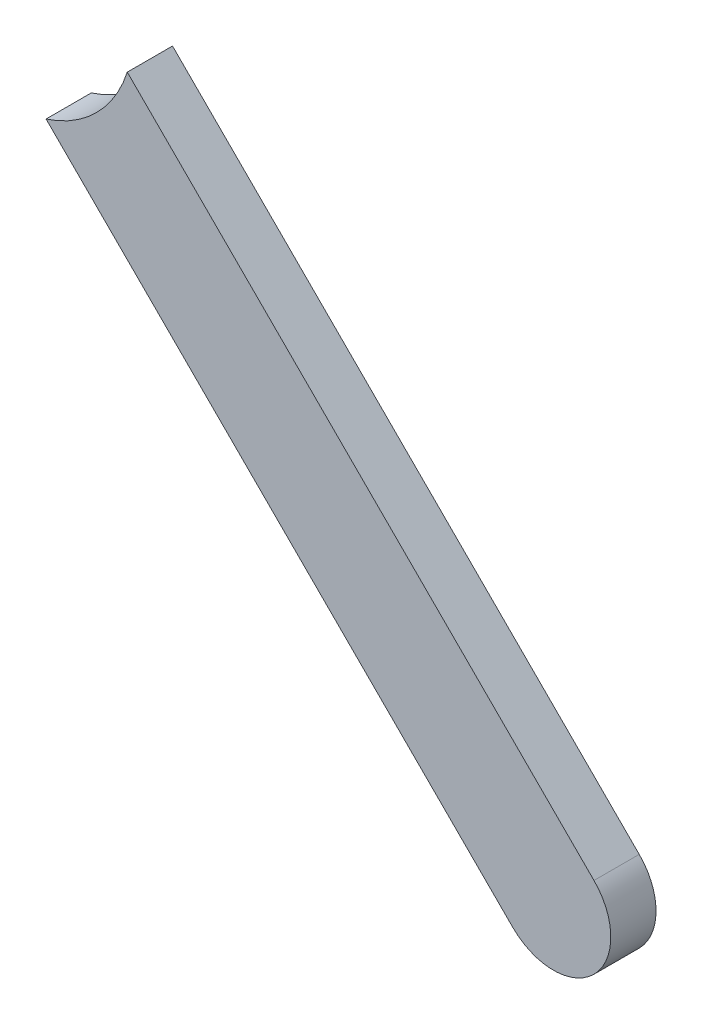
ISO-10303-21;
HEADER;
FILE_DESCRIPTION(('STEP AP214'),'2;1');
FILE_NAME('part.step','',(''),(''),'','','');
FILE_SCHEMA(('AUTOMOTIVE_DESIGN { 1 0 10303 214 1 1 1 1 }'));
ENDSEC;
DATA;
#1=APPLICATION_CONTEXT('core data for automotive mechanical design processes');
#2=APPLICATION_PROTOCOL_DEFINITION('international standard','automotive_design',2000,#1);
#3=PRODUCT_CONTEXT('',#1,'mechanical');
#4=PRODUCT('Part','Part','',(#3));
#5=PRODUCT_RELATED_PRODUCT_CATEGORY('part','',(#4));
#6=PRODUCT_DEFINITION_FORMATION('','',#4);
#7=PRODUCT_DEFINITION_CONTEXT('part definition',#1,'design');
#8=PRODUCT_DEFINITION('design','',#6,#7);
#9=PRODUCT_DEFINITION_SHAPE('','',#8);
#10=(LENGTH_UNIT() NAMED_UNIT(*) SI_UNIT(.MILLI.,.METRE.));
#11=(NAMED_UNIT(*) PLANE_ANGLE_UNIT() SI_UNIT($,.RADIAN.));
#12=(NAMED_UNIT(*) SI_UNIT($,.STERADIAN.) SOLID_ANGLE_UNIT());
#13=UNCERTAINTY_MEASURE_WITH_UNIT(LENGTH_MEASURE(1.E-05),#10,'distance_accuracy_value','');
#14=(GEOMETRIC_REPRESENTATION_CONTEXT(3) GLOBAL_UNCERTAINTY_ASSIGNED_CONTEXT((#13)) GLOBAL_UNIT_ASSIGNED_CONTEXT((#10,
#11,#12)) REPRESENTATION_CONTEXT('',''));
#15=CARTESIAN_POINT('',(0.,0.,0.));
#16=DIRECTION('',(0.,0.,1.));
#17=DIRECTION('',(1.,0.,0.));
#18=AXIS2_PLACEMENT_3D('',#15,#16,#17);
#19=CARTESIAN_POINT('',(149.140329064847,92.9404643951531,0.));
#20=DIRECTION('',(0.70710678118655,0.707106781186545,0.));
#21=DIRECTION('',(0.707106781186545,-0.70710678118655,0.));
#22=AXIS2_PLACEMENT_3D('',#19,#20,#21);
#23=PLANE('',#22);
#24=DIRECTION('',(0.707106781186545,-0.70710678118655,0.));
#25=VECTOR('',#24,1.);
#26=CARTESIAN_POINT('',(148.7913966,93.28939686,0.1999996));
#27=LINE('',#26,#25);
#28=CARTESIAN_POINT('',(149.140329064847,92.9404643951531,0.1999996));
#29=VERTEX_POINT('',#28);
#30=CARTESIAN_POINT('',(151.20439406,90.8763994,0.1999996));
#31=VERTEX_POINT('',#30);
#32=EDGE_CURVE('E11',#29,#31,#27,.T.);
#33=ORIENTED_EDGE('',*,*,#32,.F.);
#34=DIRECTION('',(0.,0.,1.));
#35=VECTOR('',#34,1.);
#36=CARTESIAN_POINT('',(149.140329064847,92.9404643951531,0.));
#37=LINE('',#36,#35);
#38=CARTESIAN_POINT('',(149.140329064847,92.9404643951531,0.));
#39=VERTEX_POINT('',#38);
#40=EDGE_CURVE('E24',#39,#29,#37,.T.);
#41=ORIENTED_EDGE('',*,*,#40,.F.);
#42=DIRECTION('',(0.707106781186545,-0.70710678118655,0.));
#43=VECTOR('',#42,1.);
#44=CARTESIAN_POINT('',(148.7913966,93.28939686,0.));
#45=LINE('',#44,#43);
#46=CARTESIAN_POINT('',(151.20439406,90.8763994,0.));
#47=VERTEX_POINT('',#46);
#48=EDGE_CURVE('E75',#39,#47,#45,.T.);
#49=ORIENTED_EDGE('',*,*,#48,.T.);
#50=DIRECTION('',(0.,0.,1.));
#51=VECTOR('',#50,1.);
#52=CARTESIAN_POINT('',(151.20439406,90.8763994,0.));
#53=LINE('',#52,#51);
#54=EDGE_CURVE('E37',#47,#31,#53,.T.);
#55=ORIENTED_EDGE('',*,*,#54,.T.);
#56=EDGE_LOOP('',(#33,#41,#49,#55));
#57=FACE_BOUND('',#56,.T.);
#58=ADVANCED_FACE('F17',(#57),#23,.F.);
#59=CARTESIAN_POINT('',(151.38399873,91.05600407,0.));
#60=DIRECTION('',(0.,0.,-1.));
#61=DIRECTION('',(-0.707106781186548,-0.707106781186548,0.));
#62=AXIS2_PLACEMENT_3D('',#59,#60,#61);
#63=CYLINDRICAL_SURFACE('',#62,0.253999360179546);
#64=CARTESIAN_POINT('',(151.38399873,91.05600407,0.1999996));
#65=DIRECTION('',(0.,0.,1.));
#66=DIRECTION('',(-0.707106781186548,-0.707106781186548,0.));
#67=AXIS2_PLACEMENT_3D('',#64,#65,#66);
#68=CIRCLE('',#67,0.253999360179546);
#69=CARTESIAN_POINT('',(151.5636034,91.23560874,0.1999996));
#70=VERTEX_POINT('',#69);
#71=EDGE_CURVE('E83',#31,#70,#68,.T.);
#72=ORIENTED_EDGE('',*,*,#71,.F.);
#73=ORIENTED_EDGE('',*,*,#54,.F.);
#74=CARTESIAN_POINT('',(151.38399873,91.05600407,0.));
#75=DIRECTION('',(0.,0.,1.));
#76=DIRECTION('',(-0.707106781186548,-0.707106781186548,0.));
#77=AXIS2_PLACEMENT_3D('',#74,#75,#76);
#78=CIRCLE('',#77,0.253999360179546);
#79=CARTESIAN_POINT('',(151.5636034,91.23560874,0.));
#80=VERTEX_POINT('',#79);
#81=EDGE_CURVE('E81',#47,#80,#78,.T.);
#82=ORIENTED_EDGE('',*,*,#81,.T.);
#83=DIRECTION('',(0.,0.,1.));
#84=VECTOR('',#83,1.);
#85=CARTESIAN_POINT('',(151.5636034,91.23560874,0.));
#86=LINE('',#85,#84);
#87=EDGE_CURVE('E67',#80,#70,#86,.T.);
#88=ORIENTED_EDGE('',*,*,#87,.T.);
#89=EDGE_LOOP('',(#72,#73,#82,#88));
#90=FACE_BOUND('',#89,.T.);
#91=ADVANCED_FACE('F89',(#90),#63,.T.);
#92=CARTESIAN_POINT('',(151.5636034,91.23560874,0.));
#93=DIRECTION('',(-0.707106781186545,-0.70710678118655,0.));
#94=DIRECTION('',(-0.70710678118655,0.707106781186545,0.));
#95=AXIS2_PLACEMENT_3D('',#92,#93,#94);
#96=PLANE('',#95);
#97=DIRECTION('',(-0.70710678118655,0.707106781186545,0.));
#98=VECTOR('',#97,1.);
#99=CARTESIAN_POINT('',(151.5636034,91.23560874,0.1999996));
#100=LINE('',#99,#98);
#101=CARTESIAN_POINT('',(149.499538404847,93.2996737351531,0.1999996));
#102=VERTEX_POINT('',#101);
#103=EDGE_CURVE('E71',#70,#102,#100,.T.);
#104=ORIENTED_EDGE('',*,*,#103,.F.);
#105=ORIENTED_EDGE('',*,*,#87,.F.);
#106=DIRECTION('',(-0.70710678118655,0.707106781186545,0.));
#107=VECTOR('',#106,1.);
#108=CARTESIAN_POINT('',(151.5636034,91.23560874,0.));
#109=LINE('',#108,#107);
#110=CARTESIAN_POINT('',(149.499538404847,93.2996737351531,0.));
#111=VERTEX_POINT('',#110);
#112=EDGE_CURVE('E63',#80,#111,#109,.T.);
#113=ORIENTED_EDGE('',*,*,#112,.T.);
#114=DIRECTION('',(0.,0.,1.));
#115=VECTOR('',#114,1.);
#116=CARTESIAN_POINT('',(149.499538404847,93.2996737351531,0.));
#117=LINE('',#116,#115);
#118=EDGE_CURVE('E53',#111,#102,#117,.T.);
#119=ORIENTED_EDGE('',*,*,#118,.T.);
#120=EDGE_LOOP('',(#104,#105,#113,#119));
#121=FACE_BOUND('',#120,.T.);
#122=ADVANCED_FACE('F66',(#121),#96,.F.);
#123=CARTESIAN_POINT('',(148.971,93.4690028,0.));
#124=DIRECTION('',(0.,0.,-1.));
#125=DIRECTION('',(1.,0.,0.));
#126=AXIS2_PLACEMENT_3D('',#123,#124,#125);
#127=CYLINDRICAL_SURFACE('',#126,0.55500016);
#128=ORIENTED_EDGE('',*,*,#40,.T.);
#129=CARTESIAN_POINT('',(148.971,93.4690028,0.1999996));
#130=DIRECTION('',(0.,0.,1.));
#131=DIRECTION('',(1.,0.,0.));
#132=AXIS2_PLACEMENT_3D('',#129,#130,#131);
#133=CIRCLE('',#132,0.55500016);
#134=EDGE_CURVE('E59',#29,#102,#133,.T.);
#135=ORIENTED_EDGE('',*,*,#134,.T.);
#136=ORIENTED_EDGE('',*,*,#118,.F.);
#137=CARTESIAN_POINT('',(148.971,93.4690028,0.));
#138=DIRECTION('',(0.,0.,1.));
#139=DIRECTION('',(1.,0.,0.));
#140=AXIS2_PLACEMENT_3D('',#137,#138,#139);
#141=CIRCLE('',#140,0.55500016);
#142=EDGE_CURVE('E57',#39,#111,#141,.T.);
#143=ORIENTED_EDGE('',*,*,#142,.F.);
#144=EDGE_LOOP('',(#128,#135,#136,#143));
#145=FACE_BOUND('',#144,.T.);
#146=ADVANCED_FACE('F55',(#145),#127,.F.);
#147=CARTESIAN_POINT('',(148.7913966,93.28939686,0.));
#148=DIRECTION('',(0.,0.,-1.));
#149=DIRECTION('',(-1.,0.,0.));
#150=AXIS2_PLACEMENT_3D('',#147,#148,#149);
#151=PLANE('',#150);
#152=ORIENTED_EDGE('',*,*,#48,.F.);
#153=ORIENTED_EDGE('',*,*,#142,.T.);
#154=ORIENTED_EDGE('',*,*,#112,.F.);
#155=ORIENTED_EDGE('',*,*,#81,.F.);
#156=EDGE_LOOP('',(#152,#153,#154,#155));
#157=FACE_BOUND('',#156,.T.);
#158=ADVANCED_FACE('F74',(#157),#151,.T.);
#159=CARTESIAN_POINT('',(148.7913966,93.28939686,0.1999996));
#160=DIRECTION('',(0.,0.,-1.));
#161=DIRECTION('',(-1.,0.,0.));
#162=AXIS2_PLACEMENT_3D('',#159,#160,#161);
#163=PLANE('',#162);
#164=ORIENTED_EDGE('',*,*,#134,.F.);
#165=ORIENTED_EDGE('',*,*,#32,.T.);
#166=ORIENTED_EDGE('',*,*,#71,.T.);
#167=ORIENTED_EDGE('',*,*,#103,.T.);
#168=EDGE_LOOP('',(#164,#165,#166,#167));
#169=FACE_BOUND('',#168,.T.);
#170=ADVANCED_FACE('F91',(#169),#163,.F.);
#171=CLOSED_SHELL('',(#58,#91,#122,#146,#158,#170));
#172=MANIFOLD_SOLID_BREP('B1',#171);
#173=ADVANCED_BREP_SHAPE_REPRESENTATION('',(#18,#172),#14);
#174=SHAPE_DEFINITION_REPRESENTATION(#9,#173);
ENDSEC;
END-ISO-10303-21;
